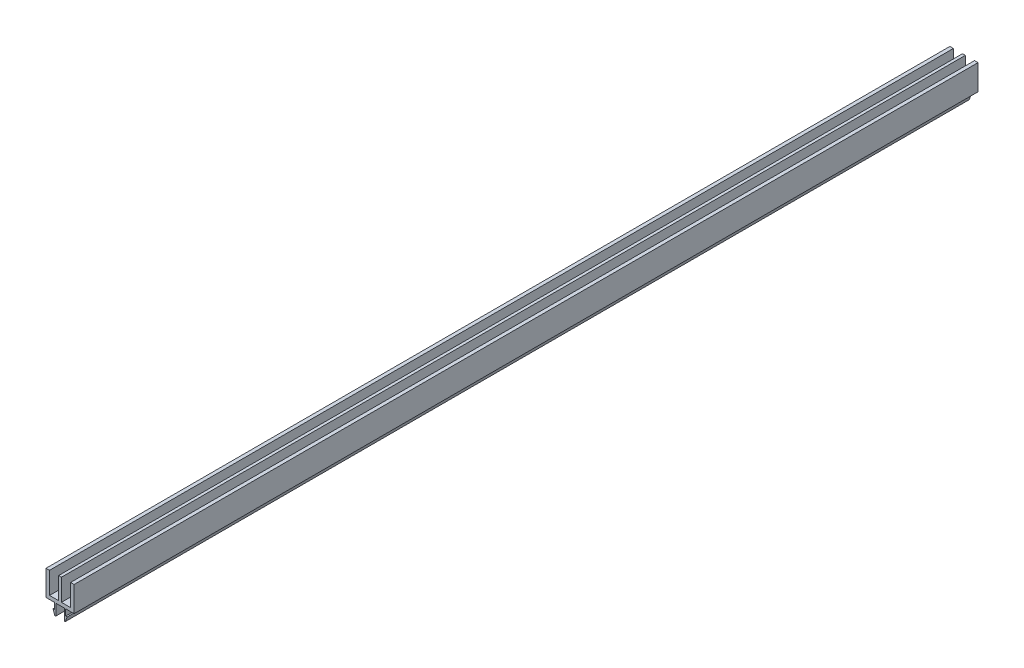
ISO-10303-21;
HEADER;
FILE_DESCRIPTION(('STEP AP214'),'2;1');
FILE_NAME('part.step','',(''),(''),'','','');
FILE_SCHEMA(('AUTOMOTIVE_DESIGN { 1 0 10303 214 1 1 1 1 }'));
ENDSEC;
DATA;
#1=APPLICATION_CONTEXT('core data for automotive mechanical design processes');
#2=APPLICATION_PROTOCOL_DEFINITION('international standard','automotive_design',2000,#1);
#3=PRODUCT_CONTEXT('',#1,'mechanical');
#4=PRODUCT('Part','Part','',(#3));
#5=PRODUCT_RELATED_PRODUCT_CATEGORY('part','',(#4));
#6=PRODUCT_DEFINITION_FORMATION('','',#4);
#7=PRODUCT_DEFINITION_CONTEXT('part definition',#1,'design');
#8=PRODUCT_DEFINITION('design','',#6,#7);
#9=PRODUCT_DEFINITION_SHAPE('','',#8);
#10=(LENGTH_UNIT() NAMED_UNIT(*) SI_UNIT(.MILLI.,.METRE.));
#11=(NAMED_UNIT(*) PLANE_ANGLE_UNIT() SI_UNIT($,.RADIAN.));
#12=(NAMED_UNIT(*) SI_UNIT($,.STERADIAN.) SOLID_ANGLE_UNIT());
#13=UNCERTAINTY_MEASURE_WITH_UNIT(LENGTH_MEASURE(1.E-05),#10,'distance_accuracy_value','');
#14=(GEOMETRIC_REPRESENTATION_CONTEXT(3) GLOBAL_UNCERTAINTY_ASSIGNED_CONTEXT((#13)) GLOBAL_UNIT_ASSIGNED_CONTEXT((#10,
#11,#12)) REPRESENTATION_CONTEXT('',''));
#15=CARTESIAN_POINT('',(0.,0.,0.));
#16=DIRECTION('',(0.,0.,1.));
#17=DIRECTION('',(1.,0.,0.));
#18=AXIS2_PLACEMENT_3D('',#15,#16,#17);
#19=CARTESIAN_POINT('',(-1.,17.9999999975,-593.09));
#20=DIRECTION('',(-1.,0.,0.));
#21=DIRECTION('',(0.,-1.,0.));
#22=AXIS2_PLACEMENT_3D('',#19,#20,#21);
#23=PLANE('',#22);
#24=DIRECTION('',(0.,-1.,0.));
#25=VECTOR('',#24,1.);
#26=CARTESIAN_POINT('',(-1.,17.9999999975,50.));
#27=LINE('',#26,#25);
#28=CARTESIAN_POINT('',(-1.,17.9999999975,50.));
#29=VERTEX_POINT('',#28);
#30=CARTESIAN_POINT('',(-1.,2.4999999995,50.));
#31=VERTEX_POINT('',#30);
#32=EDGE_CURVE('E225',#29,#31,#27,.T.);
#33=ORIENTED_EDGE('',*,*,#32,.F.);
#34=DIRECTION('',(0.,0.,1.));
#35=VECTOR('',#34,1.);
#36=CARTESIAN_POINT('',(-1.,17.9999999975,-593.09));
#37=LINE('',#36,#35);
#38=CARTESIAN_POINT('',(-1.,17.9999999975,-593.09));
#39=VERTEX_POINT('',#38);
#40=EDGE_CURVE('E11',#39,#29,#37,.T.);
#41=ORIENTED_EDGE('',*,*,#40,.F.);
#42=DIRECTION('',(0.,-1.,0.));
#43=VECTOR('',#42,1.);
#44=CARTESIAN_POINT('',(-1.,17.9999999975,-593.09));
#45=LINE('',#44,#43);
#46=CARTESIAN_POINT('',(-1.,2.4999999995,-593.09));
#47=VERTEX_POINT('',#46);
#48=EDGE_CURVE('E293',#39,#47,#45,.T.);
#49=ORIENTED_EDGE('',*,*,#48,.T.);
#50=DIRECTION('',(0.,0.,1.));
#51=VECTOR('',#50,1.);
#52=CARTESIAN_POINT('',(-1.,2.4999999995,-593.09));
#53=LINE('',#52,#51);
#54=EDGE_CURVE('E35',#47,#31,#53,.T.);
#55=ORIENTED_EDGE('',*,*,#54,.T.);
#56=EDGE_LOOP('',(#33,#41,#49,#55));
#57=FACE_BOUND('',#56,.T.);
#58=ADVANCED_FACE('F32',(#57),#23,.T.);
#59=CARTESIAN_POINT('',(0.999999999999998,17.9999999975,-593.09));
#60=DIRECTION('',(0.,1.,0.));
#61=DIRECTION('',(0.,0.,1.));
#62=AXIS2_PLACEMENT_3D('',#59,#60,#61);
#63=PLANE('',#62);
#64=DIRECTION('',(-1.,0.,0.));
#65=VECTOR('',#64,1.);
#66=CARTESIAN_POINT('',(0.999999999999998,17.9999999975,50.));
#67=LINE('',#66,#65);
#68=CARTESIAN_POINT('',(0.999999999999998,17.9999999975,50.));
#69=VERTEX_POINT('',#68);
#70=EDGE_CURVE('E291',#69,#29,#67,.T.);
#71=ORIENTED_EDGE('',*,*,#70,.F.);
#72=DIRECTION('',(0.,0.,1.));
#73=VECTOR('',#72,1.);
#74=CARTESIAN_POINT('',(0.999999999999998,17.9999999975,-593.09));
#75=LINE('',#74,#73);
#76=CARTESIAN_POINT('',(0.999999999999998,17.9999999975,-593.09));
#77=VERTEX_POINT('',#76);
#78=EDGE_CURVE('E41',#77,#69,#75,.T.);
#79=ORIENTED_EDGE('',*,*,#78,.F.);
#80=DIRECTION('',(-1.,0.,0.));
#81=VECTOR('',#80,1.);
#82=CARTESIAN_POINT('',(0.999999999999998,17.9999999975,-593.09));
#83=LINE('',#82,#81);
#84=EDGE_CURVE('E215',#77,#39,#83,.T.);
#85=ORIENTED_EDGE('',*,*,#84,.T.);
#86=ORIENTED_EDGE('',*,*,#40,.T.);
#87=EDGE_LOOP('',(#71,#79,#85,#86));
#88=FACE_BOUND('',#87,.T.);
#89=ADVANCED_FACE('F337',(#88),#63,.T.);
#90=CARTESIAN_POINT('',(0.999999999999998,2.4999999995,-593.09));
#91=DIRECTION('',(1.,0.,0.));
#92=DIRECTION('',(0.,0.,-1.));
#93=AXIS2_PLACEMENT_3D('',#90,#91,#92);
#94=PLANE('',#93);
#95=DIRECTION('',(0.,1.,0.));
#96=VECTOR('',#95,1.);
#97=CARTESIAN_POINT('',(0.999999999999998,2.4999999995,50.));
#98=LINE('',#97,#96);
#99=CARTESIAN_POINT('',(0.999999999999998,2.4999999995,50.));
#100=VERTEX_POINT('',#99);
#101=EDGE_CURVE('E202',#100,#69,#98,.T.);
#102=ORIENTED_EDGE('',*,*,#101,.F.);
#103=DIRECTION('',(0.,0.,1.));
#104=VECTOR('',#103,1.);
#105=CARTESIAN_POINT('',(0.999999999999998,2.4999999995,-593.09));
#106=LINE('',#105,#104);
#107=CARTESIAN_POINT('',(0.999999999999998,2.4999999995,-593.09));
#108=VERTEX_POINT('',#107);
#109=EDGE_CURVE('E197',#108,#100,#106,.T.);
#110=ORIENTED_EDGE('',*,*,#109,.F.);
#111=DIRECTION('',(0.,1.,0.));
#112=VECTOR('',#111,1.);
#113=CARTESIAN_POINT('',(0.999999999999998,2.4999999995,-593.09));
#114=LINE('',#113,#112);
#115=EDGE_CURVE('E200',#108,#77,#114,.T.);
#116=ORIENTED_EDGE('',*,*,#115,.T.);
#117=ORIENTED_EDGE('',*,*,#78,.T.);
#118=EDGE_LOOP('',(#102,#110,#116,#117));
#119=FACE_BOUND('',#118,.T.);
#120=ADVANCED_FACE('F199',(#119),#94,.T.);
#121=CARTESIAN_POINT('',(7.5,2.4999999995,-593.09));
#122=DIRECTION('',(0.,1.,0.));
#123=DIRECTION('',(-1.,0.,0.));
#124=AXIS2_PLACEMENT_3D('',#121,#122,#123);
#125=PLANE('',#124);
#126=DIRECTION('',(-1.,0.,0.));
#127=VECTOR('',#126,1.);
#128=CARTESIAN_POINT('',(7.5,2.4999999995,50.));
#129=LINE('',#128,#127);
#130=CARTESIAN_POINT('',(7.5,2.4999999995,50.));
#131=VERTEX_POINT('',#130);
#132=EDGE_CURVE('E288',#131,#100,#129,.T.);
#133=ORIENTED_EDGE('',*,*,#132,.F.);
#134=DIRECTION('',(0.,0.,1.));
#135=VECTOR('',#134,1.);
#136=CARTESIAN_POINT('',(7.5,2.4999999995,-593.09));
#137=LINE('',#136,#135);
#138=CARTESIAN_POINT('',(7.5,2.4999999995,-593.09));
#139=VERTEX_POINT('',#138);
#140=EDGE_CURVE('E207',#139,#131,#137,.T.);
#141=ORIENTED_EDGE('',*,*,#140,.F.);
#142=DIRECTION('',(-1.,0.,0.));
#143=VECTOR('',#142,1.);
#144=CARTESIAN_POINT('',(7.5,2.4999999995,-593.09));
#145=LINE('',#144,#143);
#146=EDGE_CURVE('E213',#139,#108,#145,.T.);
#147=ORIENTED_EDGE('',*,*,#146,.T.);
#148=ORIENTED_EDGE('',*,*,#109,.T.);
#149=EDGE_LOOP('',(#133,#141,#147,#148));
#150=FACE_BOUND('',#149,.T.);
#151=ADVANCED_FACE('F217',(#150),#125,.T.);
#152=CARTESIAN_POINT('',(7.5,17.9999999975,-593.09));
#153=DIRECTION('',(-1.,0.,0.));
#154=DIRECTION('',(0.,-1.,0.));
#155=AXIS2_PLACEMENT_3D('',#152,#153,#154);
#156=PLANE('',#155);
#157=DIRECTION('',(0.,-1.,0.));
#158=VECTOR('',#157,1.);
#159=CARTESIAN_POINT('',(7.5,17.9999999975,50.));
#160=LINE('',#159,#158);
#161=CARTESIAN_POINT('',(7.5,17.9999999975,50.));
#162=VERTEX_POINT('',#161);
#163=EDGE_CURVE('E285',#162,#131,#160,.T.);
#164=ORIENTED_EDGE('',*,*,#163,.F.);
#165=DIRECTION('',(0.,0.,1.));
#166=VECTOR('',#165,1.);
#167=CARTESIAN_POINT('',(7.5,17.9999999975,-593.09));
#168=LINE('',#167,#166);
#169=CARTESIAN_POINT('',(7.5,17.9999999975,-593.09));
#170=VERTEX_POINT('',#169);
#171=EDGE_CURVE('E297',#170,#162,#168,.T.);
#172=ORIENTED_EDGE('',*,*,#171,.F.);
#173=DIRECTION('',(0.,-1.,0.));
#174=VECTOR('',#173,1.);
#175=CARTESIAN_POINT('',(7.5,17.9999999975,-593.09));
#176=LINE('',#175,#174);
#177=EDGE_CURVE('E218',#170,#139,#176,.T.);
#178=ORIENTED_EDGE('',*,*,#177,.T.);
#179=ORIENTED_EDGE('',*,*,#140,.T.);
#180=EDGE_LOOP('',(#164,#172,#178,#179));
#181=FACE_BOUND('',#180,.T.);
#182=ADVANCED_FACE('F350',(#181),#156,.T.);
#183=CARTESIAN_POINT('',(10.,17.9999999975,-593.09));
#184=DIRECTION('',(0.,1.,0.));
#185=DIRECTION('',(0.,0.,1.));
#186=AXIS2_PLACEMENT_3D('',#183,#184,#185);
#187=PLANE('',#186);
#188=DIRECTION('',(-1.,0.,0.));
#189=VECTOR('',#188,1.);
#190=CARTESIAN_POINT('',(10.,17.9999999975,50.));
#191=LINE('',#190,#189);
#192=CARTESIAN_POINT('',(10.,17.9999999975,50.));
#193=VERTEX_POINT('',#192);
#194=EDGE_CURVE('E282',#193,#162,#191,.T.);
#195=ORIENTED_EDGE('',*,*,#194,.F.);
#196=DIRECTION('',(0.,0.,1.));
#197=VECTOR('',#196,1.);
#198=CARTESIAN_POINT('',(10.,17.9999999975,-593.09));
#199=LINE('',#198,#197);
#200=CARTESIAN_POINT('',(10.,17.9999999975,-593.09));
#201=VERTEX_POINT('',#200);
#202=EDGE_CURVE('E299',#201,#193,#199,.T.);
#203=ORIENTED_EDGE('',*,*,#202,.F.);
#204=DIRECTION('',(-1.,0.,0.));
#205=VECTOR('',#204,1.);
#206=CARTESIAN_POINT('',(10.,17.9999999975,-593.09));
#207=LINE('',#206,#205);
#208=EDGE_CURVE('E220',#201,#170,#207,.T.);
#209=ORIENTED_EDGE('',*,*,#208,.T.);
#210=ORIENTED_EDGE('',*,*,#171,.T.);
#211=EDGE_LOOP('',(#195,#203,#209,#210));
#212=FACE_BOUND('',#211,.T.);
#213=ADVANCED_FACE('F353',(#212),#187,.T.);
#214=CARTESIAN_POINT('',(10.,-4.99999828349541E-10,-593.09));
#215=DIRECTION('',(1.,0.,0.));
#216=DIRECTION('',(0.,0.,-1.));
#217=AXIS2_PLACEMENT_3D('',#214,#215,#216);
#218=PLANE('',#217);
#219=DIRECTION('',(0.,1.,0.));
#220=VECTOR('',#219,1.);
#221=CARTESIAN_POINT('',(10.,-4.99999828349541E-10,50.));
#222=LINE('',#221,#220);
#223=CARTESIAN_POINT('',(10.,-4.99999828349541E-10,50.));
#224=VERTEX_POINT('',#223);
#225=EDGE_CURVE('E279',#224,#193,#222,.T.);
#226=ORIENTED_EDGE('',*,*,#225,.F.);
#227=DIRECTION('',(0.,0.,1.));
#228=VECTOR('',#227,1.);
#229=CARTESIAN_POINT('',(10.,-4.99999828349541E-10,-593.09));
#230=LINE('',#229,#228);
#231=CARTESIAN_POINT('',(10.,-4.99999828349541E-10,-593.09));
#232=VERTEX_POINT('',#231);
#233=EDGE_CURVE('E301',#232,#224,#230,.T.);
#234=ORIENTED_EDGE('',*,*,#233,.F.);
#235=DIRECTION('',(0.,1.,0.));
#236=VECTOR('',#235,1.);
#237=CARTESIAN_POINT('',(10.,-4.99999828349541E-10,-593.09));
#238=LINE('',#237,#236);
#239=EDGE_CURVE('E643',#232,#201,#238,.T.);
#240=ORIENTED_EDGE('',*,*,#239,.T.);
#241=ORIENTED_EDGE('',*,*,#202,.T.);
#242=EDGE_LOOP('',(#226,#234,#240,#241));
#243=FACE_BOUND('',#242,.T.);
#244=ADVANCED_FACE('F357',(#243),#218,.T.);
#245=CARTESIAN_POINT('',(4.,-4.99999998002099E-10,-593.09));
#246=DIRECTION('',(0.,-1.,0.));
#247=DIRECTION('',(1.,0.,0.));
#248=AXIS2_PLACEMENT_3D('',#245,#246,#247);
#249=PLANE('',#248);
#250=DIRECTION('',(1.,0.,0.));
#251=VECTOR('',#250,1.);
#252=CARTESIAN_POINT('',(4.,-4.99999998002099E-10,50.));
#253=LINE('',#252,#251);
#254=CARTESIAN_POINT('',(4.,-4.99999998002099E-10,50.));
#255=VERTEX_POINT('',#254);
#256=EDGE_CURVE('E276',#255,#224,#253,.T.);
#257=ORIENTED_EDGE('',*,*,#256,.F.);
#258=DIRECTION('',(0.,0.,1.));
#259=VECTOR('',#258,1.);
#260=CARTESIAN_POINT('',(4.,-4.99999998002099E-10,-593.09));
#261=LINE('',#260,#259);
#262=CARTESIAN_POINT('',(4.,-4.99999998002099E-10,-593.09));
#263=VERTEX_POINT('',#262);
#264=EDGE_CURVE('E303',#263,#255,#261,.T.);
#265=ORIENTED_EDGE('',*,*,#264,.F.);
#266=DIRECTION('',(1.,0.,0.));
#267=VECTOR('',#266,1.);
#268=CARTESIAN_POINT('',(4.,-4.99999998002099E-10,-593.09));
#269=LINE('',#268,#267);
#270=EDGE_CURVE('E647',#263,#232,#269,.T.);
#271=ORIENTED_EDGE('',*,*,#270,.T.);
#272=ORIENTED_EDGE('',*,*,#233,.T.);
#273=EDGE_LOOP('',(#257,#265,#271,#272));
#274=FACE_BOUND('',#273,.T.);
#275=ADVANCED_FACE('F361',(#274),#249,.T.);
#276=CARTESIAN_POINT('',(4.,-4.5,-593.09));
#277=DIRECTION('',(1.,0.,0.));
#278=DIRECTION('',(0.,0.,-1.));
#279=AXIS2_PLACEMENT_3D('',#276,#277,#278);
#280=PLANE('',#279);
#281=DIRECTION('',(0.,1.,0.));
#282=VECTOR('',#281,1.);
#283=CARTESIAN_POINT('',(4.,-4.5,50.));
#284=LINE('',#283,#282);
#285=CARTESIAN_POINT('',(4.,-4.5,50.));
#286=VERTEX_POINT('',#285);
#287=EDGE_CURVE('E273',#286,#255,#284,.T.);
#288=ORIENTED_EDGE('',*,*,#287,.F.);
#289=DIRECTION('',(0.,0.,1.));
#290=VECTOR('',#289,1.);
#291=CARTESIAN_POINT('',(4.,-4.5,-593.09));
#292=LINE('',#291,#290);
#293=CARTESIAN_POINT('',(4.,-4.5,-593.09));
#294=VERTEX_POINT('',#293);
#295=EDGE_CURVE('E305',#294,#286,#292,.T.);
#296=ORIENTED_EDGE('',*,*,#295,.F.);
#297=DIRECTION('',(0.,1.,0.));
#298=VECTOR('',#297,1.);
#299=CARTESIAN_POINT('',(4.,-4.5,-593.09));
#300=LINE('',#299,#298);
#301=EDGE_CURVE('E636',#294,#263,#300,.T.);
#302=ORIENTED_EDGE('',*,*,#301,.T.);
#303=ORIENTED_EDGE('',*,*,#264,.T.);
#304=EDGE_LOOP('',(#288,#296,#302,#303));
#305=FACE_BOUND('',#304,.T.);
#306=ADVANCED_FACE('F365',(#305),#280,.T.);
#307=CARTESIAN_POINT('',(5.,-4.5,-593.09));
#308=DIRECTION('',(0.,1.,0.));
#309=DIRECTION('',(0.,0.,1.));
#310=AXIS2_PLACEMENT_3D('',#307,#308,#309);
#311=PLANE('',#310);
#312=DIRECTION('',(-1.,0.,0.));
#313=VECTOR('',#312,1.);
#314=CARTESIAN_POINT('',(5.,-4.5,50.));
#315=LINE('',#314,#313);
#316=CARTESIAN_POINT('',(5.,-4.5,50.));
#317=VERTEX_POINT('',#316);
#318=EDGE_CURVE('E270',#317,#286,#315,.T.);
#319=ORIENTED_EDGE('',*,*,#318,.F.);
#320=DIRECTION('',(0.,0.,1.));
#321=VECTOR('',#320,1.);
#322=CARTESIAN_POINT('',(5.,-4.5,-593.09));
#323=LINE('',#322,#321);
#324=CARTESIAN_POINT('',(5.,-4.5,-593.09));
#325=VERTEX_POINT('',#324);
#326=EDGE_CURVE('E307',#325,#317,#323,.T.);
#327=ORIENTED_EDGE('',*,*,#326,.F.);
#328=DIRECTION('',(-1.,0.,0.));
#329=VECTOR('',#328,1.);
#330=CARTESIAN_POINT('',(5.,-4.5,-593.09));
#331=LINE('',#330,#329);
#332=EDGE_CURVE('E632',#325,#294,#331,.T.);
#333=ORIENTED_EDGE('',*,*,#332,.T.);
#334=ORIENTED_EDGE('',*,*,#295,.T.);
#335=EDGE_LOOP('',(#319,#327,#333,#334));
#336=FACE_BOUND('',#335,.T.);
#337=ADVANCED_FACE('F369',(#336),#311,.T.);
#338=CARTESIAN_POINT('',(3.75,-8.,-593.09));
#339=DIRECTION('',(0.941741911594837,-0.336336396998156,0.));
#340=DIRECTION('',(0.336336396998157,0.941741911594838,0.));
#341=AXIS2_PLACEMENT_3D('',#338,#339,#340);
#342=PLANE('',#341);
#343=DIRECTION('',(0.336336396998157,0.941741911594837,0.));
#344=VECTOR('',#343,1.);
#345=CARTESIAN_POINT('',(3.75,-8.,50.));
#346=LINE('',#345,#344);
#347=CARTESIAN_POINT('',(3.75,-8.,50.));
#348=VERTEX_POINT('',#347);
#349=EDGE_CURVE('E267',#348,#317,#346,.T.);
#350=ORIENTED_EDGE('',*,*,#349,.F.);
#351=DIRECTION('',(0.,0.,1.));
#352=VECTOR('',#351,1.);
#353=CARTESIAN_POINT('',(3.75,-8.,-593.09));
#354=LINE('',#353,#352);
#355=CARTESIAN_POINT('',(3.75,-8.,-593.09));
#356=VERTEX_POINT('',#355);
#357=EDGE_CURVE('E309',#356,#348,#354,.T.);
#358=ORIENTED_EDGE('',*,*,#357,.F.);
#359=DIRECTION('',(0.336336396998157,0.941741911594837,0.));
#360=VECTOR('',#359,1.);
#361=CARTESIAN_POINT('',(3.75,-8.,-593.09));
#362=LINE('',#361,#360);
#363=EDGE_CURVE('E653',#356,#325,#362,.T.);
#364=ORIENTED_EDGE('',*,*,#363,.T.);
#365=ORIENTED_EDGE('',*,*,#326,.T.);
#366=EDGE_LOOP('',(#350,#358,#364,#365));
#367=FACE_BOUND('',#366,.T.);
#368=ADVANCED_FACE('F373',(#367),#342,.T.);
#369=CARTESIAN_POINT('',(3.,-8.,-593.09));
#370=DIRECTION('',(0.,-1.,0.));
#371=DIRECTION('',(0.,0.,-1.));
#372=AXIS2_PLACEMENT_3D('',#369,#370,#371);
#373=PLANE('',#372);
#374=DIRECTION('',(1.,0.,0.));
#375=VECTOR('',#374,1.);
#376=CARTESIAN_POINT('',(3.,-8.,50.));
#377=LINE('',#376,#375);
#378=CARTESIAN_POINT('',(3.,-8.,50.));
#379=VERTEX_POINT('',#378);
#380=EDGE_CURVE('E264',#379,#348,#377,.T.);
#381=ORIENTED_EDGE('',*,*,#380,.F.);
#382=DIRECTION('',(0.,0.,1.));
#383=VECTOR('',#382,1.);
#384=CARTESIAN_POINT('',(3.,-8.,-593.09));
#385=LINE('',#384,#383);
#386=CARTESIAN_POINT('',(3.,-8.,-593.09));
#387=VERTEX_POINT('',#386);
#388=EDGE_CURVE('E311',#387,#379,#385,.T.);
#389=ORIENTED_EDGE('',*,*,#388,.F.);
#390=DIRECTION('',(1.,0.,0.));
#391=VECTOR('',#390,1.);
#392=CARTESIAN_POINT('',(3.,-8.,-593.09));
#393=LINE('',#392,#391);
#394=EDGE_CURVE('E625',#387,#356,#393,.T.);
#395=ORIENTED_EDGE('',*,*,#394,.T.);
#396=ORIENTED_EDGE('',*,*,#357,.T.);
#397=EDGE_LOOP('',(#381,#389,#395,#396));
#398=FACE_BOUND('',#397,.T.);
#399=ADVANCED_FACE('F377',(#398),#373,.T.);
#400=CARTESIAN_POINT('',(3.,-4.9999985194348E-10,-593.09));
#401=DIRECTION('',(-1.,0.,0.));
#402=DIRECTION('',(0.,0.,1.));
#403=AXIS2_PLACEMENT_3D('',#400,#401,#402);
#404=PLANE('',#403);
#405=DIRECTION('',(0.,-1.,0.));
#406=VECTOR('',#405,1.);
#407=CARTESIAN_POINT('',(3.,-4.9999985194348E-10,50.));
#408=LINE('',#407,#406);
#409=CARTESIAN_POINT('',(3.,-4.9999985194348E-10,50.));
#410=VERTEX_POINT('',#409);
#411=EDGE_CURVE('E261',#410,#379,#408,.T.);
#412=ORIENTED_EDGE('',*,*,#411,.F.);
#413=DIRECTION('',(0.,0.,1.));
#414=VECTOR('',#413,1.);
#415=CARTESIAN_POINT('',(3.,-4.9999985194348E-10,-593.09));
#416=LINE('',#415,#414);
#417=CARTESIAN_POINT('',(3.,-4.9999985194348E-10,-593.09));
#418=VERTEX_POINT('',#417);
#419=EDGE_CURVE('E313',#418,#410,#416,.T.);
#420=ORIENTED_EDGE('',*,*,#419,.F.);
#421=DIRECTION('',(0.,-1.,0.));
#422=VECTOR('',#421,1.);
#423=CARTESIAN_POINT('',(3.,-4.9999985194348E-10,-593.09));
#424=LINE('',#423,#422);
#425=EDGE_CURVE('E621',#418,#387,#424,.T.);
#426=ORIENTED_EDGE('',*,*,#425,.T.);
#427=ORIENTED_EDGE('',*,*,#388,.T.);
#428=EDGE_LOOP('',(#412,#420,#426,#427));
#429=FACE_BOUND('',#428,.T.);
#430=ADVANCED_FACE('F381',(#429),#404,.T.);
#431=CARTESIAN_POINT('',(-3.,-4.99999455901012E-10,-593.09));
#432=DIRECTION('',(0.,-1.,0.));
#433=DIRECTION('',(1.,0.,0.));
#434=AXIS2_PLACEMENT_3D('',#431,#432,#433);
#435=PLANE('',#434);
#436=DIRECTION('',(1.,0.,0.));
#437=VECTOR('',#436,1.);
#438=CARTESIAN_POINT('',(-3.,-4.99999455901012E-10,50.));
#439=LINE('',#438,#437);
#440=CARTESIAN_POINT('',(-3.,-4.99999455901012E-10,50.));
#441=VERTEX_POINT('',#440);
#442=EDGE_CURVE('E258',#441,#410,#439,.T.);
#443=ORIENTED_EDGE('',*,*,#442,.F.);
#444=DIRECTION('',(0.,0.,1.));
#445=VECTOR('',#444,1.);
#446=CARTESIAN_POINT('',(-3.,-4.99999455901012E-10,-593.09));
#447=LINE('',#446,#445);
#448=CARTESIAN_POINT('',(-3.,-4.99999455901012E-10,-593.09));
#449=VERTEX_POINT('',#448);
#450=EDGE_CURVE('E315',#449,#441,#447,.T.);
#451=ORIENTED_EDGE('',*,*,#450,.F.);
#452=DIRECTION('',(1.,0.,0.));
#453=VECTOR('',#452,1.);
#454=CARTESIAN_POINT('',(-3.,-4.99999455901012E-10,-593.09));
#455=LINE('',#454,#453);
#456=EDGE_CURVE('E657',#449,#418,#455,.T.);
#457=ORIENTED_EDGE('',*,*,#456,.T.);
#458=ORIENTED_EDGE('',*,*,#419,.T.);
#459=EDGE_LOOP('',(#443,#451,#457,#458));
#460=FACE_BOUND('',#459,.T.);
#461=ADVANCED_FACE('F385',(#460),#435,.T.);
#462=CARTESIAN_POINT('',(-3.,-8.,-593.09));
#463=DIRECTION('',(1.,0.,0.));
#464=DIRECTION('',(0.,0.,-1.));
#465=AXIS2_PLACEMENT_3D('',#462,#463,#464);
#466=PLANE('',#465);
#467=DIRECTION('',(0.,1.,0.));
#468=VECTOR('',#467,1.);
#469=CARTESIAN_POINT('',(-3.,-8.,50.));
#470=LINE('',#469,#468);
#471=CARTESIAN_POINT('',(-3.,-8.,50.));
#472=VERTEX_POINT('',#471);
#473=EDGE_CURVE('E255',#472,#441,#470,.T.);
#474=ORIENTED_EDGE('',*,*,#473,.F.);
#475=DIRECTION('',(0.,0.,1.));
#476=VECTOR('',#475,1.);
#477=CARTESIAN_POINT('',(-3.,-8.,-593.09));
#478=LINE('',#477,#476);
#479=CARTESIAN_POINT('',(-3.,-8.,-593.09));
#480=VERTEX_POINT('',#479);
#481=EDGE_CURVE('E317',#480,#472,#478,.T.);
#482=ORIENTED_EDGE('',*,*,#481,.F.);
#483=DIRECTION('',(0.,1.,0.));
#484=VECTOR('',#483,1.);
#485=CARTESIAN_POINT('',(-3.,-8.,-593.09));
#486=LINE('',#485,#484);
#487=EDGE_CURVE('E614',#480,#449,#486,.T.);
#488=ORIENTED_EDGE('',*,*,#487,.T.);
#489=ORIENTED_EDGE('',*,*,#450,.T.);
#490=EDGE_LOOP('',(#474,#482,#488,#489));
#491=FACE_BOUND('',#490,.T.);
#492=ADVANCED_FACE('F389',(#491),#466,.T.);
#493=CARTESIAN_POINT('',(-3.75,-8.,-593.09));
#494=DIRECTION('',(0.,-1.,0.));
#495=DIRECTION('',(0.,0.,-1.));
#496=AXIS2_PLACEMENT_3D('',#493,#494,#495);
#497=PLANE('',#496);
#498=DIRECTION('',(1.,0.,0.));
#499=VECTOR('',#498,1.);
#500=CARTESIAN_POINT('',(-3.75,-8.,50.));
#501=LINE('',#500,#499);
#502=CARTESIAN_POINT('',(-3.75,-8.,50.));
#503=VERTEX_POINT('',#502);
#504=EDGE_CURVE('E252',#503,#472,#501,.T.);
#505=ORIENTED_EDGE('',*,*,#504,.F.);
#506=DIRECTION('',(0.,0.,1.));
#507=VECTOR('',#506,1.);
#508=CARTESIAN_POINT('',(-3.75,-8.,-593.09));
#509=LINE('',#508,#507);
#510=CARTESIAN_POINT('',(-3.75,-8.,-593.09));
#511=VERTEX_POINT('',#510);
#512=EDGE_CURVE('E319',#511,#503,#509,.T.);
#513=ORIENTED_EDGE('',*,*,#512,.F.);
#514=DIRECTION('',(1.,0.,0.));
#515=VECTOR('',#514,1.);
#516=CARTESIAN_POINT('',(-3.75,-8.,-593.09));
#517=LINE('',#516,#515);
#518=EDGE_CURVE('E610',#511,#480,#517,.T.);
#519=ORIENTED_EDGE('',*,*,#518,.T.);
#520=ORIENTED_EDGE('',*,*,#481,.T.);
#521=EDGE_LOOP('',(#505,#513,#519,#520));
#522=FACE_BOUND('',#521,.T.);
#523=ADVANCED_FACE('F393',(#522),#497,.T.);
#524=CARTESIAN_POINT('',(-5.,-4.5,-593.09));
#525=DIRECTION('',(-0.941741911594838,-0.336336396998156,0.));
#526=DIRECTION('',(0.336336396998156,-0.941741911594838,0.));
#527=AXIS2_PLACEMENT_3D('',#524,#525,#526);
#528=PLANE('',#527);
#529=DIRECTION('',(0.336336396998156,-0.941741911594837,0.));
#530=VECTOR('',#529,1.);
#531=CARTESIAN_POINT('',(-5.,-4.5,50.));
#532=LINE('',#531,#530);
#533=CARTESIAN_POINT('',(-5.,-4.5,50.));
#534=VERTEX_POINT('',#533);
#535=EDGE_CURVE('E249',#534,#503,#532,.T.);
#536=ORIENTED_EDGE('',*,*,#535,.F.);
#537=DIRECTION('',(0.,0.,1.));
#538=VECTOR('',#537,1.);
#539=CARTESIAN_POINT('',(-5.,-4.5,-593.09));
#540=LINE('',#539,#538);
#541=CARTESIAN_POINT('',(-5.,-4.5,-593.09));
#542=VERTEX_POINT('',#541);
#543=EDGE_CURVE('E321',#542,#534,#540,.T.);
#544=ORIENTED_EDGE('',*,*,#543,.F.);
#545=DIRECTION('',(0.336336396998156,-0.941741911594837,0.));
#546=VECTOR('',#545,1.);
#547=CARTESIAN_POINT('',(-5.,-4.5,-593.09));
#548=LINE('',#547,#546);
#549=EDGE_CURVE('E661',#542,#511,#548,.T.);
#550=ORIENTED_EDGE('',*,*,#549,.T.);
#551=ORIENTED_EDGE('',*,*,#512,.T.);
#552=EDGE_LOOP('',(#536,#544,#550,#551));
#553=FACE_BOUND('',#552,.T.);
#554=ADVANCED_FACE('F397',(#553),#528,.T.);
#555=CARTESIAN_POINT('',(-4.,-4.5,-593.09));
#556=DIRECTION('',(0.,1.,0.));
#557=DIRECTION('',(0.,0.,1.));
#558=AXIS2_PLACEMENT_3D('',#555,#556,#557);
#559=PLANE('',#558);
#560=DIRECTION('',(-1.,0.,0.));
#561=VECTOR('',#560,1.);
#562=CARTESIAN_POINT('',(-4.,-4.5,50.));
#563=LINE('',#562,#561);
#564=CARTESIAN_POINT('',(-4.,-4.5,50.));
#565=VERTEX_POINT('',#564);
#566=EDGE_CURVE('E246',#565,#534,#563,.T.);
#567=ORIENTED_EDGE('',*,*,#566,.F.);
#568=DIRECTION('',(0.,0.,1.));
#569=VECTOR('',#568,1.);
#570=CARTESIAN_POINT('',(-4.,-4.5,-593.09));
#571=LINE('',#570,#569);
#572=CARTESIAN_POINT('',(-4.,-4.5,-593.09));
#573=VERTEX_POINT('',#572);
#574=EDGE_CURVE('E323',#573,#565,#571,.T.);
#575=ORIENTED_EDGE('',*,*,#574,.F.);
#576=DIRECTION('',(-1.,0.,0.));
#577=VECTOR('',#576,1.);
#578=CARTESIAN_POINT('',(-4.,-4.5,-593.09));
#579=LINE('',#578,#577);
#580=EDGE_CURVE('E603',#573,#542,#579,.T.);
#581=ORIENTED_EDGE('',*,*,#580,.T.);
#582=ORIENTED_EDGE('',*,*,#543,.T.);
#583=EDGE_LOOP('',(#567,#575,#581,#582));
#584=FACE_BOUND('',#583,.T.);
#585=ADVANCED_FACE('F401',(#584),#559,.T.);
#586=CARTESIAN_POINT('',(-4.,-4.9999985194348E-10,-593.09));
#587=DIRECTION('',(-1.,0.,0.));
#588=DIRECTION('',(0.,0.,1.));
#589=AXIS2_PLACEMENT_3D('',#586,#587,#588);
#590=PLANE('',#589);
#591=DIRECTION('',(0.,-1.,0.));
#592=VECTOR('',#591,1.);
#593=CARTESIAN_POINT('',(-4.,-4.9999985194348E-10,50.));
#594=LINE('',#593,#592);
#595=CARTESIAN_POINT('',(-4.,-4.9999985194348E-10,50.));
#596=VERTEX_POINT('',#595);
#597=EDGE_CURVE('E243',#596,#565,#594,.T.);
#598=ORIENTED_EDGE('',*,*,#597,.F.);
#599=DIRECTION('',(0.,0.,1.));
#600=VECTOR('',#599,1.);
#601=CARTESIAN_POINT('',(-4.,-4.9999985194348E-10,-593.09));
#602=LINE('',#601,#600);
#603=CARTESIAN_POINT('',(-4.,-4.9999985194348E-10,-593.09));
#604=VERTEX_POINT('',#603);
#605=EDGE_CURVE('E325',#604,#596,#602,.T.);
#606=ORIENTED_EDGE('',*,*,#605,.F.);
#607=DIRECTION('',(0.,-1.,0.));
#608=VECTOR('',#607,1.);
#609=CARTESIAN_POINT('',(-4.,-4.9999985194348E-10,-593.09));
#610=LINE('',#609,#608);
#611=EDGE_CURVE('E599',#604,#573,#610,.T.);
#612=ORIENTED_EDGE('',*,*,#611,.T.);
#613=ORIENTED_EDGE('',*,*,#574,.T.);
#614=EDGE_LOOP('',(#598,#606,#612,#613));
#615=FACE_BOUND('',#614,.T.);
#616=ADVANCED_FACE('F405',(#615),#590,.T.);
#617=CARTESIAN_POINT('',(-10.,-4.99999719929324E-10,-593.09));
#618=DIRECTION('',(0.,-1.,0.));
#619=DIRECTION('',(1.,0.,0.));
#620=AXIS2_PLACEMENT_3D('',#617,#618,#619);
#621=PLANE('',#620);
#622=DIRECTION('',(1.,0.,0.));
#623=VECTOR('',#622,1.);
#624=CARTESIAN_POINT('',(-10.,-4.99999719929324E-10,50.));
#625=LINE('',#624,#623);
#626=CARTESIAN_POINT('',(-10.,-4.99999719929324E-10,50.));
#627=VERTEX_POINT('',#626);
#628=EDGE_CURVE('E240',#627,#596,#625,.T.);
#629=ORIENTED_EDGE('',*,*,#628,.F.);
#630=DIRECTION('',(0.,0.,1.));
#631=VECTOR('',#630,1.);
#632=CARTESIAN_POINT('',(-10.,-4.99999719929324E-10,-593.09));
#633=LINE('',#632,#631);
#634=CARTESIAN_POINT('',(-10.,-4.99999719929324E-10,-593.09));
#635=VERTEX_POINT('',#634);
#636=EDGE_CURVE('E327',#635,#627,#633,.T.);
#637=ORIENTED_EDGE('',*,*,#636,.F.);
#638=DIRECTION('',(1.,0.,0.));
#639=VECTOR('',#638,1.);
#640=CARTESIAN_POINT('',(-10.,-4.99999719929324E-10,-593.09));
#641=LINE('',#640,#639);
#642=EDGE_CURVE('E665',#635,#604,#641,.T.);
#643=ORIENTED_EDGE('',*,*,#642,.T.);
#644=ORIENTED_EDGE('',*,*,#605,.T.);
#645=EDGE_LOOP('',(#629,#637,#643,#644));
#646=FACE_BOUND('',#645,.T.);
#647=ADVANCED_FACE('F409',(#646),#621,.T.);
#648=CARTESIAN_POINT('',(-10.,17.9999999975,-593.09));
#649=DIRECTION('',(-1.,0.,0.));
#650=DIRECTION('',(0.,-1.,0.));
#651=AXIS2_PLACEMENT_3D('',#648,#649,#650);
#652=PLANE('',#651);
#653=DIRECTION('',(0.,-1.,0.));
#654=VECTOR('',#653,1.);
#655=CARTESIAN_POINT('',(-10.,17.9999999975,50.));
#656=LINE('',#655,#654);
#657=CARTESIAN_POINT('',(-10.,17.9999999975,50.));
#658=VERTEX_POINT('',#657);
#659=EDGE_CURVE('E237',#658,#627,#656,.T.);
#660=ORIENTED_EDGE('',*,*,#659,.F.);
#661=DIRECTION('',(0.,0.,1.));
#662=VECTOR('',#661,1.);
#663=CARTESIAN_POINT('',(-10.,17.9999999975,-593.09));
#664=LINE('',#663,#662);
#665=CARTESIAN_POINT('',(-10.,17.9999999975,-593.09));
#666=VERTEX_POINT('',#665);
#667=EDGE_CURVE('E329',#666,#658,#664,.T.);
#668=ORIENTED_EDGE('',*,*,#667,.F.);
#669=DIRECTION('',(0.,-1.,0.));
#670=VECTOR('',#669,1.);
#671=CARTESIAN_POINT('',(-10.,17.9999999975,-593.09));
#672=LINE('',#671,#670);
#673=EDGE_CURVE('E592',#666,#635,#672,.T.);
#674=ORIENTED_EDGE('',*,*,#673,.T.);
#675=ORIENTED_EDGE('',*,*,#636,.T.);
#676=EDGE_LOOP('',(#660,#668,#674,#675));
#677=FACE_BOUND('',#676,.T.);
#678=ADVANCED_FACE('F413',(#677),#652,.T.);
#679=CARTESIAN_POINT('',(-7.5,17.9999999975,-593.09));
#680=DIRECTION('',(0.,1.,0.));
#681=DIRECTION('',(0.,0.,1.));
#682=AXIS2_PLACEMENT_3D('',#679,#680,#681);
#683=PLANE('',#682);
#684=DIRECTION('',(-1.,0.,0.));
#685=VECTOR('',#684,1.);
#686=CARTESIAN_POINT('',(-7.5,17.9999999975,50.));
#687=LINE('',#686,#685);
#688=CARTESIAN_POINT('',(-7.5,17.9999999975,50.));
#689=VERTEX_POINT('',#688);
#690=EDGE_CURVE('E234',#689,#658,#687,.T.);
#691=ORIENTED_EDGE('',*,*,#690,.F.);
#692=DIRECTION('',(0.,0.,1.));
#693=VECTOR('',#692,1.);
#694=CARTESIAN_POINT('',(-7.5,17.9999999975,-593.09));
#695=LINE('',#694,#693);
#696=CARTESIAN_POINT('',(-7.5,17.9999999975,-593.09));
#697=VERTEX_POINT('',#696);
#698=EDGE_CURVE('E331',#697,#689,#695,.T.);
#699=ORIENTED_EDGE('',*,*,#698,.F.);
#700=DIRECTION('',(-1.,0.,0.));
#701=VECTOR('',#700,1.);
#702=CARTESIAN_POINT('',(-7.5,17.9999999975,-593.09));
#703=LINE('',#702,#701);
#704=EDGE_CURVE('E588',#697,#666,#703,.T.);
#705=ORIENTED_EDGE('',*,*,#704,.T.);
#706=ORIENTED_EDGE('',*,*,#667,.T.);
#707=EDGE_LOOP('',(#691,#699,#705,#706));
#708=FACE_BOUND('',#707,.T.);
#709=ADVANCED_FACE('F417',(#708),#683,.T.);
#710=CARTESIAN_POINT('',(-7.5,2.4999999995,-593.09));
#711=DIRECTION('',(1.,0.,0.));
#712=DIRECTION('',(0.,0.,-1.));
#713=AXIS2_PLACEMENT_3D('',#710,#711,#712);
#714=PLANE('',#713);
#715=DIRECTION('',(0.,1.,0.));
#716=VECTOR('',#715,1.);
#717=CARTESIAN_POINT('',(-7.5,2.4999999995,50.));
#718=LINE('',#717,#716);
#719=CARTESIAN_POINT('',(-7.5,2.4999999995,50.));
#720=VERTEX_POINT('',#719);
#721=EDGE_CURVE('E231',#720,#689,#718,.T.);
#722=ORIENTED_EDGE('',*,*,#721,.F.);
#723=DIRECTION('',(0.,0.,1.));
#724=VECTOR('',#723,1.);
#725=CARTESIAN_POINT('',(-7.5,2.4999999995,-593.09));
#726=LINE('',#725,#724);
#727=CARTESIAN_POINT('',(-7.5,2.4999999995,-593.09));
#728=VERTEX_POINT('',#727);
#729=EDGE_CURVE('E332',#728,#720,#726,.T.);
#730=ORIENTED_EDGE('',*,*,#729,.F.);
#731=DIRECTION('',(0.,1.,0.));
#732=VECTOR('',#731,1.);
#733=CARTESIAN_POINT('',(-7.5,2.4999999995,-593.09));
#734=LINE('',#733,#732);
#735=EDGE_CURVE('E669',#728,#697,#734,.T.);
#736=ORIENTED_EDGE('',*,*,#735,.T.);
#737=ORIENTED_EDGE('',*,*,#698,.T.);
#738=EDGE_LOOP('',(#722,#730,#736,#737));
#739=FACE_BOUND('',#738,.T.);
#740=ADVANCED_FACE('F421',(#739),#714,.T.);
#741=CARTESIAN_POINT('',(-1.,2.4999999995,-593.09));
#742=DIRECTION('',(0.,1.,0.));
#743=DIRECTION('',(-1.,0.,0.));
#744=AXIS2_PLACEMENT_3D('',#741,#742,#743);
#745=PLANE('',#744);
#746=DIRECTION('',(-1.,0.,0.));
#747=VECTOR('',#746,1.);
#748=CARTESIAN_POINT('',(-1.,2.4999999995,50.));
#749=LINE('',#748,#747);
#750=EDGE_CURVE('E228',#31,#720,#749,.T.);
#751=ORIENTED_EDGE('',*,*,#750,.F.);
#752=ORIENTED_EDGE('',*,*,#54,.F.);
#753=DIRECTION('',(-1.,0.,0.));
#754=VECTOR('',#753,1.);
#755=CARTESIAN_POINT('',(-1.,2.4999999995,-593.09));
#756=LINE('',#755,#754);
#757=EDGE_CURVE('E671',#47,#728,#756,.T.);
#758=ORIENTED_EDGE('',*,*,#757,.T.);
#759=ORIENTED_EDGE('',*,*,#729,.T.);
#760=EDGE_LOOP('',(#751,#752,#758,#759));
#761=FACE_BOUND('',#760,.T.);
#762=ADVANCED_FACE('F334',(#761),#745,.T.);
#763=CARTESIAN_POINT('',(0.,0.,-593.09));
#764=DIRECTION('',(0.,0.,-1.));
#765=DIRECTION('',(-1.,0.,0.));
#766=AXIS2_PLACEMENT_3D('',#763,#764,#765);
#767=PLANE('',#766);
#768=ORIENTED_EDGE('',*,*,#48,.F.);
#769=ORIENTED_EDGE('',*,*,#84,.F.);
#770=ORIENTED_EDGE('',*,*,#115,.F.);
#771=ORIENTED_EDGE('',*,*,#146,.F.);
#772=ORIENTED_EDGE('',*,*,#177,.F.);
#773=ORIENTED_EDGE('',*,*,#208,.F.);
#774=ORIENTED_EDGE('',*,*,#239,.F.);
#775=ORIENTED_EDGE('',*,*,#270,.F.);
#776=ORIENTED_EDGE('',*,*,#301,.F.);
#777=ORIENTED_EDGE('',*,*,#332,.F.);
#778=ORIENTED_EDGE('',*,*,#363,.F.);
#779=ORIENTED_EDGE('',*,*,#394,.F.);
#780=ORIENTED_EDGE('',*,*,#425,.F.);
#781=ORIENTED_EDGE('',*,*,#456,.F.);
#782=ORIENTED_EDGE('',*,*,#487,.F.);
#783=ORIENTED_EDGE('',*,*,#518,.F.);
#784=ORIENTED_EDGE('',*,*,#549,.F.);
#785=ORIENTED_EDGE('',*,*,#580,.F.);
#786=ORIENTED_EDGE('',*,*,#611,.F.);
#787=ORIENTED_EDGE('',*,*,#642,.F.);
#788=ORIENTED_EDGE('',*,*,#673,.F.);
#789=ORIENTED_EDGE('',*,*,#704,.F.);
#790=ORIENTED_EDGE('',*,*,#735,.F.);
#791=ORIENTED_EDGE('',*,*,#757,.F.);
#792=EDGE_LOOP('',(#768,#769,#770,#771,#772,#773,#774,#775,#776,#777,#778,#779,#780,#781,#782,
#783,#784,#785,#786,#787,#788,#789,#790,#791));
#793=FACE_BOUND('',#792,.T.);
#794=ADVANCED_FACE('F211',(#793),#767,.T.);
#795=CARTESIAN_POINT('',(0.,0.,50.));
#796=DIRECTION('',(0.,0.,-1.));
#797=DIRECTION('',(-1.,0.,0.));
#798=AXIS2_PLACEMENT_3D('',#795,#796,#797);
#799=PLANE('',#798);
#800=ORIENTED_EDGE('',*,*,#32,.T.);
#801=ORIENTED_EDGE('',*,*,#750,.T.);
#802=ORIENTED_EDGE('',*,*,#721,.T.);
#803=ORIENTED_EDGE('',*,*,#690,.T.);
#804=ORIENTED_EDGE('',*,*,#659,.T.);
#805=ORIENTED_EDGE('',*,*,#628,.T.);
#806=ORIENTED_EDGE('',*,*,#597,.T.);
#807=ORIENTED_EDGE('',*,*,#566,.T.);
#808=ORIENTED_EDGE('',*,*,#535,.T.);
#809=ORIENTED_EDGE('',*,*,#504,.T.);
#810=ORIENTED_EDGE('',*,*,#473,.T.);
#811=ORIENTED_EDGE('',*,*,#442,.T.);
#812=ORIENTED_EDGE('',*,*,#411,.T.);
#813=ORIENTED_EDGE('',*,*,#380,.T.);
#814=ORIENTED_EDGE('',*,*,#349,.T.);
#815=ORIENTED_EDGE('',*,*,#318,.T.);
#816=ORIENTED_EDGE('',*,*,#287,.T.);
#817=ORIENTED_EDGE('',*,*,#256,.T.);
#818=ORIENTED_EDGE('',*,*,#225,.T.);
#819=ORIENTED_EDGE('',*,*,#194,.T.);
#820=ORIENTED_EDGE('',*,*,#163,.T.);
#821=ORIENTED_EDGE('',*,*,#132,.T.);
#822=ORIENTED_EDGE('',*,*,#101,.T.);
#823=ORIENTED_EDGE('',*,*,#70,.T.);
#824=EDGE_LOOP('',(#800,#801,#802,#803,#804,#805,#806,#807,#808,#809,#810,#811,#812,#813,#814,
#815,#816,#817,#818,#819,#820,#821,#822,#823));
#825=FACE_BOUND('',#824,.T.);
#826=ADVANCED_FACE('F336',(#825),#799,.F.);
#827=CLOSED_SHELL('',(#58,#89,#120,#151,#182,#213,#244,#275,#306,#337,#368,#399,#430,#461,#492,
#523,#554,#585,#616,#647,#678,#709,#740,#762,#794,#826));
#828=MANIFOLD_SOLID_BREP('B2',#827);
#829=ADVANCED_BREP_SHAPE_REPRESENTATION('',(#18,#828),#14);
#830=SHAPE_DEFINITION_REPRESENTATION(#9,#829);
ENDSEC;
END-ISO-10303-21;
